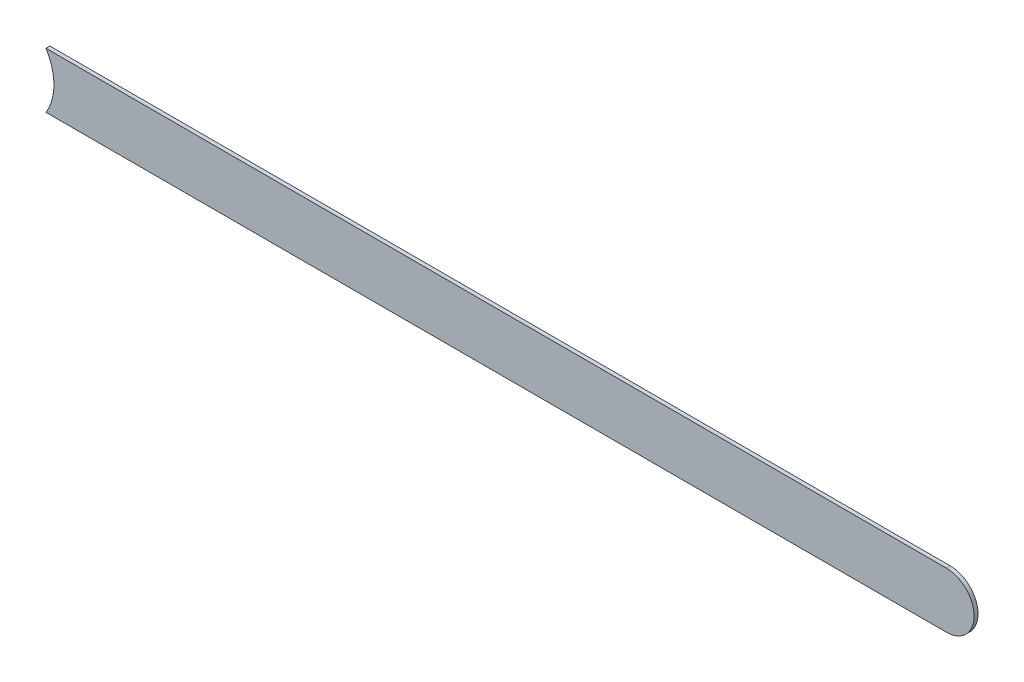
ISO-10303-21;
HEADER;
FILE_DESCRIPTION(('STEP AP214'),'2;1');
FILE_NAME('part.step','',(''),(''),'','','');
FILE_SCHEMA(('AUTOMOTIVE_DESIGN { 1 0 10303 214 1 1 1 1 }'));
ENDSEC;
DATA;
#1=APPLICATION_CONTEXT('core data for automotive mechanical design processes');
#2=APPLICATION_PROTOCOL_DEFINITION('international standard','automotive_design',2000,#1);
#3=PRODUCT_CONTEXT('',#1,'mechanical');
#4=PRODUCT('Part','Part','',(#3));
#5=PRODUCT_RELATED_PRODUCT_CATEGORY('part','',(#4));
#6=PRODUCT_DEFINITION_FORMATION('','',#4);
#7=PRODUCT_DEFINITION_CONTEXT('part definition',#1,'design');
#8=PRODUCT_DEFINITION('design','',#6,#7);
#9=PRODUCT_DEFINITION_SHAPE('','',#8);
#10=(LENGTH_UNIT() NAMED_UNIT(*) SI_UNIT(.MILLI.,.METRE.));
#11=(NAMED_UNIT(*) PLANE_ANGLE_UNIT() SI_UNIT($,.RADIAN.));
#12=(NAMED_UNIT(*) SI_UNIT($,.STERADIAN.) SOLID_ANGLE_UNIT());
#13=UNCERTAINTY_MEASURE_WITH_UNIT(LENGTH_MEASURE(1.E-05),#10,'distance_accuracy_value','');
#14=(GEOMETRIC_REPRESENTATION_CONTEXT(3) GLOBAL_UNCERTAINTY_ASSIGNED_CONTEXT((#13)) GLOBAL_UNIT_ASSIGNED_CONTEXT((#10,
#11,#12)) REPRESENTATION_CONTEXT('',''));
#15=CARTESIAN_POINT('',(0.,0.,0.));
#16=DIRECTION('',(0.,0.,1.));
#17=DIRECTION('',(1.,0.,0.));
#18=AXIS2_PLACEMENT_3D('',#15,#16,#17);
#19=CARTESIAN_POINT('',(80.,-97.586,1.6));
#20=DIRECTION('',(0.,1.,0.));
#21=DIRECTION('',(1.,0.,0.));
#22=AXIS2_PLACEMENT_3D('',#19,#20,#21);
#23=PLANE('',#22);
#24=DIRECTION('',(0.,0.,1.));
#25=VECTOR('',#24,1.);
#26=CARTESIAN_POINT('',(88.514,-97.586,1.6));
#27=LINE('',#26,#25);
#28=CARTESIAN_POINT('',(88.514,-97.586,1.6));
#29=VERTEX_POINT('',#28);
#30=CARTESIAN_POINT('',(88.514,-97.586,1.635));
#31=VERTEX_POINT('',#30);
#32=EDGE_CURVE('E11',#29,#31,#27,.T.);
#33=ORIENTED_EDGE('',*,*,#32,.T.);
#34=DIRECTION('',(1.,0.,0.));
#35=VECTOR('',#34,1.);
#36=CARTESIAN_POINT('',(80.,-97.586,1.635));
#37=LINE('',#36,#35);
#38=CARTESIAN_POINT('',(80.403887360539,-97.586,1.635));
#39=VERTEX_POINT('',#38);
#40=EDGE_CURVE('E21',#39,#31,#37,.T.);
#41=ORIENTED_EDGE('',*,*,#40,.F.);
#42=DIRECTION('',(0.,0.,-1.));
#43=VECTOR('',#42,1.);
#44=CARTESIAN_POINT('',(80.403887360535,-97.586,-0.045));
#45=LINE('',#44,#43);
#46=CARTESIAN_POINT('',(80.403887360539,-97.586,1.6));
#47=VERTEX_POINT('',#46);
#48=EDGE_CURVE('E72',#39,#47,#45,.T.);
#49=ORIENTED_EDGE('',*,*,#48,.T.);
#50=DIRECTION('',(1.,0.,0.));
#51=VECTOR('',#50,1.);
#52=CARTESIAN_POINT('',(80.,-97.586,1.6));
#53=LINE('',#52,#51);
#54=EDGE_CURVE('E63',#47,#29,#53,.T.);
#55=ORIENTED_EDGE('',*,*,#54,.T.);
#56=EDGE_LOOP('',(#33,#41,#49,#55));
#57=FACE_BOUND('',#56,.T.);
#58=ADVANCED_FACE('F17',(#57),#23,.F.);
#59=CARTESIAN_POINT('',(88.514,-97.336,1.6));
#60=DIRECTION('',(0.,0.,-1.));
#61=DIRECTION('',(0.,-1.,0.));
#62=AXIS2_PLACEMENT_3D('',#59,#60,#61);
#63=CYLINDRICAL_SURFACE('',#62,0.25);
#64=CARTESIAN_POINT('',(88.514,-97.336,1.6));
#65=DIRECTION('',(0.,0.,1.));
#66=DIRECTION('',(0.,-1.,0.));
#67=AXIS2_PLACEMENT_3D('',#64,#65,#66);
#68=CIRCLE('',#67,0.25);
#69=CARTESIAN_POINT('',(88.514,-97.086,1.6));
#70=VERTEX_POINT('',#69);
#71=EDGE_CURVE('E55',#29,#70,#68,.T.);
#72=ORIENTED_EDGE('',*,*,#71,.T.);
#73=DIRECTION('',(0.,0.,1.));
#74=VECTOR('',#73,1.);
#75=CARTESIAN_POINT('',(88.514,-97.086,1.6));
#76=LINE('',#75,#74);
#77=CARTESIAN_POINT('',(88.514,-97.086,1.635));
#78=VERTEX_POINT('',#77);
#79=EDGE_CURVE('E82',#70,#78,#76,.T.);
#80=ORIENTED_EDGE('',*,*,#79,.T.);
#81=CARTESIAN_POINT('',(88.514,-97.336,1.635));
#82=DIRECTION('',(0.,0.,1.));
#83=DIRECTION('',(0.,-1.,0.));
#84=AXIS2_PLACEMENT_3D('',#81,#82,#83);
#85=CIRCLE('',#84,0.25);
#86=EDGE_CURVE('E58',#31,#78,#85,.T.);
#87=ORIENTED_EDGE('',*,*,#86,.F.);
#88=ORIENTED_EDGE('',*,*,#32,.F.);
#89=EDGE_LOOP('',(#72,#80,#87,#88));
#90=FACE_BOUND('',#89,.T.);
#91=ADVANCED_FACE('F19',(#90),#63,.T.);
#92=CARTESIAN_POINT('',(88.514,-97.086,1.635));
#93=DIRECTION('',(0.,0.,1.));
#94=DIRECTION('',(1.,0.,0.));
#95=AXIS2_PLACEMENT_3D('',#92,#93,#94);
#96=PLANE('',#95);
#97=ORIENTED_EDGE('',*,*,#86,.T.);
#98=DIRECTION('',(-1.,0.,0.));
#99=VECTOR('',#98,1.);
#100=CARTESIAN_POINT('',(88.514,-97.086,1.635));
#101=LINE('',#100,#99);
#102=CARTESIAN_POINT('',(80.403887360536,-97.086,1.635));
#103=VERTEX_POINT('',#102);
#104=EDGE_CURVE('E120',#78,#103,#101,.T.);
#105=ORIENTED_EDGE('',*,*,#104,.T.);
#106=CARTESIAN_POINT('',(80.,-97.336,1.635));
#107=DIRECTION('',(0.,0.,-1.));
#108=DIRECTION('',(0.,-1.,0.));
#109=AXIS2_PLACEMENT_3D('',#106,#107,#108);
#110=CIRCLE('',#109,0.475);
#111=EDGE_CURVE('E68',#103,#39,#110,.T.);
#112=ORIENTED_EDGE('',*,*,#111,.T.);
#113=ORIENTED_EDGE('',*,*,#40,.T.);
#114=EDGE_LOOP('',(#97,#105,#112,#113));
#115=FACE_BOUND('',#114,.T.);
#116=ADVANCED_FACE('F154',(#115),#96,.T.);
#117=CARTESIAN_POINT('',(80.,-97.336,-0.045));
#118=DIRECTION('',(0.,0.,-1.));
#119=DIRECTION('',(0.,-1.,0.));
#120=AXIS2_PLACEMENT_3D('',#117,#118,#119);
#121=CYLINDRICAL_SURFACE('',#120,0.475);
#122=ORIENTED_EDGE('',*,*,#111,.F.);
#123=DIRECTION('',(0.,0.,-1.));
#124=VECTOR('',#123,1.);
#125=CARTESIAN_POINT('',(80.403887360535,-97.086,-0.045));
#126=LINE('',#125,#124);
#127=CARTESIAN_POINT('',(80.403887360536,-97.086,1.6));
#128=VERTEX_POINT('',#127);
#129=EDGE_CURVE('E126',#103,#128,#126,.T.);
#130=ORIENTED_EDGE('',*,*,#129,.T.);
#131=CARTESIAN_POINT('',(80.,-97.336,1.6));
#132=DIRECTION('',(0.,0.,-1.));
#133=DIRECTION('',(0.,-1.,0.));
#134=AXIS2_PLACEMENT_3D('',#131,#132,#133);
#135=CIRCLE('',#134,0.475);
#136=EDGE_CURVE('E69',#128,#47,#135,.T.);
#137=ORIENTED_EDGE('',*,*,#136,.T.);
#138=ORIENTED_EDGE('',*,*,#48,.F.);
#139=EDGE_LOOP('',(#122,#130,#137,#138));
#140=FACE_BOUND('',#139,.T.);
#141=ADVANCED_FACE('F138',(#140),#121,.F.);
#142=CARTESIAN_POINT('',(88.514,-97.086,1.6));
#143=DIRECTION('',(0.,0.,1.));
#144=DIRECTION('',(1.,0.,0.));
#145=AXIS2_PLACEMENT_3D('',#142,#143,#144);
#146=PLANE('',#145);
#147=ORIENTED_EDGE('',*,*,#54,.F.);
#148=ORIENTED_EDGE('',*,*,#136,.F.);
#149=DIRECTION('',(-1.,0.,0.));
#150=VECTOR('',#149,1.);
#151=CARTESIAN_POINT('',(88.514,-97.086,1.6));
#152=LINE('',#151,#150);
#153=EDGE_CURVE('E65',#70,#128,#152,.T.);
#154=ORIENTED_EDGE('',*,*,#153,.F.);
#155=ORIENTED_EDGE('',*,*,#71,.F.);
#156=EDGE_LOOP('',(#147,#148,#154,#155));
#157=FACE_BOUND('',#156,.T.);
#158=ADVANCED_FACE('F61',(#157),#146,.F.);
#159=CARTESIAN_POINT('',(88.514,-97.086,1.6));
#160=DIRECTION('',(0.,-1.,0.));
#161=DIRECTION('',(0.,0.,-1.));
#162=AXIS2_PLACEMENT_3D('',#159,#160,#161);
#163=PLANE('',#162);
#164=ORIENTED_EDGE('',*,*,#129,.F.);
#165=ORIENTED_EDGE('',*,*,#104,.F.);
#166=ORIENTED_EDGE('',*,*,#79,.F.);
#167=ORIENTED_EDGE('',*,*,#153,.T.);
#168=EDGE_LOOP('',(#164,#165,#166,#167));
#169=FACE_BOUND('',#168,.T.);
#170=ADVANCED_FACE('F145',(#169),#163,.F.);
#171=CLOSED_SHELL('',(#58,#91,#116,#141,#158,#170));
#172=MANIFOLD_SOLID_BREP('B1',#171);
#173=ADVANCED_BREP_SHAPE_REPRESENTATION('',(#18,#172),#14);
#174=SHAPE_DEFINITION_REPRESENTATION(#9,#173);
ENDSEC;
END-ISO-10303-21;
